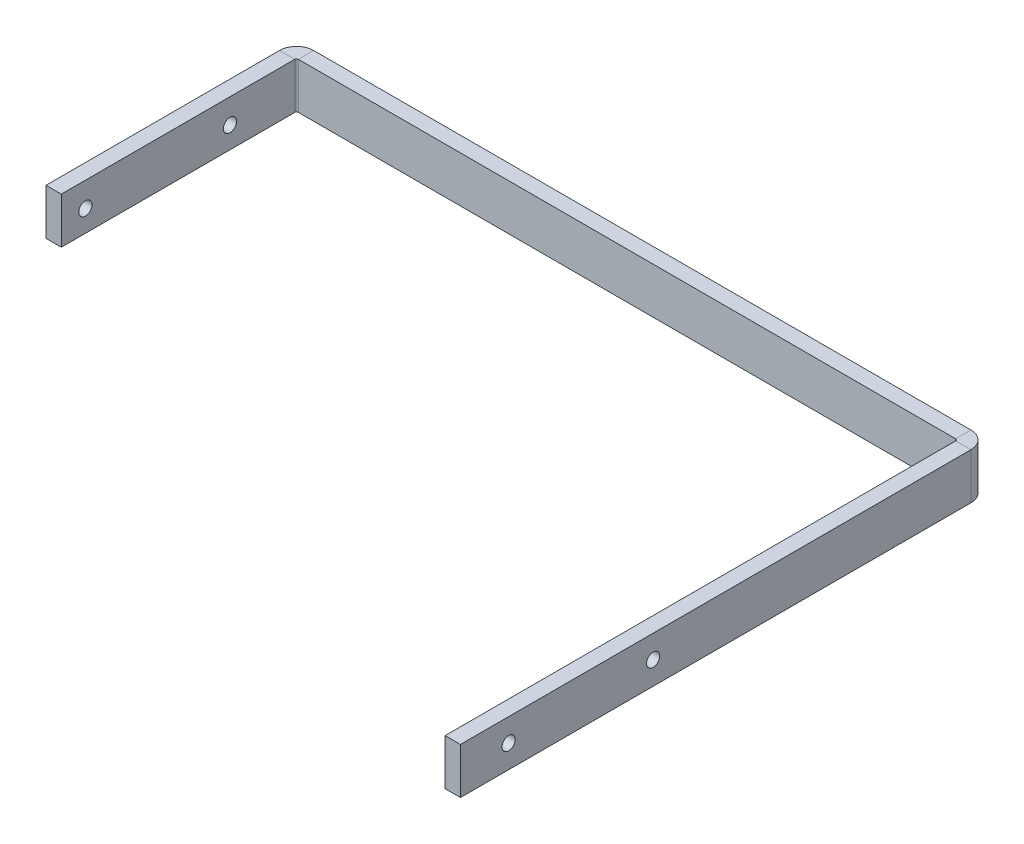
ISO-10303-21;
HEADER;
FILE_DESCRIPTION(('STEP AP214'),'2;1');
FILE_NAME('part.step','',(''),(''),'','','');
FILE_SCHEMA(('AUTOMOTIVE_DESIGN { 1 0 10303 214 1 1 1 1 }'));
ENDSEC;
DATA;
#1=APPLICATION_CONTEXT('core data for automotive mechanical design processes');
#2=APPLICATION_PROTOCOL_DEFINITION('international standard','automotive_design',2000,#1);
#3=PRODUCT_CONTEXT('',#1,'mechanical');
#4=PRODUCT('Part','Part','',(#3));
#5=PRODUCT_RELATED_PRODUCT_CATEGORY('part','',(#4));
#6=PRODUCT_DEFINITION_FORMATION('','',#4);
#7=PRODUCT_DEFINITION_CONTEXT('part definition',#1,'design');
#8=PRODUCT_DEFINITION('design','',#6,#7);
#9=PRODUCT_DEFINITION_SHAPE('','',#8);
#10=(LENGTH_UNIT() NAMED_UNIT(*) SI_UNIT(.MILLI.,.METRE.));
#11=(NAMED_UNIT(*) PLANE_ANGLE_UNIT() SI_UNIT($,.RADIAN.));
#12=(NAMED_UNIT(*) SI_UNIT($,.STERADIAN.) SOLID_ANGLE_UNIT());
#13=UNCERTAINTY_MEASURE_WITH_UNIT(LENGTH_MEASURE(1.E-05),#10,'distance_accuracy_value','');
#14=(GEOMETRIC_REPRESENTATION_CONTEXT(3) GLOBAL_UNCERTAINTY_ASSIGNED_CONTEXT((#13)) GLOBAL_UNIT_ASSIGNED_CONTEXT((#10,
#11,#12)) REPRESENTATION_CONTEXT('',''));
#15=CARTESIAN_POINT('',(0.,0.,0.));
#16=DIRECTION('',(0.,0.,1.));
#17=DIRECTION('',(1.,0.,0.));
#18=AXIS2_PLACEMENT_3D('',#15,#16,#17);
#19=CARTESIAN_POINT('',(355.844279829867,0.,-6.35));
#20=DIRECTION('',(0.,-1.,0.));
#21=DIRECTION('',(1.,0.,0.));
#22=AXIS2_PLACEMENT_3D('',#19,#20,#21);
#23=PLANE('',#22);
#24=DIRECTION('',(1.,0.,0.));
#25=VECTOR('',#24,1.);
#26=CARTESIAN_POINT('',(355.844279829867,0.,-6.35));
#27=LINE('',#26,#25);
#28=CARTESIAN_POINT('',(-135.083556714187,0.,-6.35));
#29=VERTEX_POINT('',#28);
#30=CARTESIAN_POINT('',(137.772116373922,0.,-6.35));
#31=VERTEX_POINT('',#30);
#32=EDGE_CURVE('E230',#29,#31,#27,.T.);
#33=ORIENTED_EDGE('',*,*,#32,.T.);
#34=DIRECTION('',(0.,0.,1.));
#35=VECTOR('',#34,1.);
#36=CARTESIAN_POINT('',(137.772116373922,0.,-6.35));
#37=LINE('',#36,#35);
#38=CARTESIAN_POINT('',(137.772116373922,0.,0.));
#39=VERTEX_POINT('',#38);
#40=EDGE_CURVE('E12',#31,#39,#37,.T.);
#41=ORIENTED_EDGE('',*,*,#40,.T.);
#42=DIRECTION('',(1.,0.,0.));
#43=VECTOR('',#42,1.);
#44=CARTESIAN_POINT('',(355.844279829867,0.,0.));
#45=LINE('',#44,#43);
#46=CARTESIAN_POINT('',(-135.083556714187,0.,0.));
#47=VERTEX_POINT('',#46);
#48=EDGE_CURVE('E247',#47,#39,#45,.T.);
#49=ORIENTED_EDGE('',*,*,#48,.F.);
#50=DIRECTION('',(0.,0.,1.));
#51=VECTOR('',#50,1.);
#52=CARTESIAN_POINT('',(-135.083556714187,0.,-6.35));
#53=LINE('',#52,#51);
#54=EDGE_CURVE('E229',#29,#47,#53,.T.);
#55=ORIENTED_EDGE('',*,*,#54,.F.);
#56=EDGE_LOOP('',(#33,#41,#49,#55));
#57=FACE_BOUND('',#56,.T.);
#58=ADVANCED_FACE('F48',(#57),#23,.T.);
#59=CARTESIAN_POINT('',(355.844279829867,19.0954773869347,-6.35));
#60=DIRECTION('',(0.,1.,0.));
#61=DIRECTION('',(-1.,0.,0.));
#62=AXIS2_PLACEMENT_3D('',#59,#60,#61);
#63=PLANE('',#62);
#64=DIRECTION('',(-1.,0.,0.));
#65=VECTOR('',#64,1.);
#66=CARTESIAN_POINT('',(355.844279829867,19.0954773869347,0.));
#67=LINE('',#66,#65);
#68=CARTESIAN_POINT('',(137.772116373922,19.0954773869347,0.));
#69=VERTEX_POINT('',#68);
#70=CARTESIAN_POINT('',(-135.083556714187,19.0954773869346,0.));
#71=VERTEX_POINT('',#70);
#72=EDGE_CURVE('E72',#69,#71,#67,.T.);
#73=ORIENTED_EDGE('',*,*,#72,.F.);
#74=DIRECTION('',(0.,0.,-1.));
#75=VECTOR('',#74,1.);
#76=CARTESIAN_POINT('',(137.772116373922,19.0954773869347,-6.35));
#77=LINE('',#76,#75);
#78=CARTESIAN_POINT('',(137.772116373922,19.0954773869347,-6.35));
#79=VERTEX_POINT('',#78);
#80=EDGE_CURVE('E241',#69,#79,#77,.T.);
#81=ORIENTED_EDGE('',*,*,#80,.T.);
#82=DIRECTION('',(-1.,0.,0.));
#83=VECTOR('',#82,1.);
#84=CARTESIAN_POINT('',(355.844279829867,19.0954773869347,-6.35));
#85=LINE('',#84,#83);
#86=CARTESIAN_POINT('',(-135.083556714187,19.0954773869347,-6.35));
#87=VERTEX_POINT('',#86);
#88=EDGE_CURVE('E51',#79,#87,#85,.T.);
#89=ORIENTED_EDGE('',*,*,#88,.T.);
#90=DIRECTION('',(0.,0.,-1.));
#91=VECTOR('',#90,1.);
#92=CARTESIAN_POINT('',(-135.083556714187,19.0954773869346,-6.35));
#93=LINE('',#92,#91);
#94=EDGE_CURVE('E235',#71,#87,#93,.T.);
#95=ORIENTED_EDGE('',*,*,#94,.F.);
#96=EDGE_LOOP('',(#73,#81,#89,#95));
#97=FACE_BOUND('',#96,.T.);
#98=ADVANCED_FACE('F252',(#97),#63,.T.);
#99=CARTESIAN_POINT('',(0.,0.,-6.35));
#100=DIRECTION('',(0.,0.,-1.));
#101=DIRECTION('',(-1.,0.,0.));
#102=AXIS2_PLACEMENT_3D('',#99,#100,#101);
#103=PLANE('',#102);
#104=ORIENTED_EDGE('',*,*,#88,.F.);
#105=DIRECTION('',(0.,-1.,0.));
#106=VECTOR('',#105,1.);
#107=CARTESIAN_POINT('',(137.772116373922,-2.00253930093311E-13,-6.35));
#108=LINE('',#107,#106);
#109=EDGE_CURVE('E238',#79,#31,#108,.T.);
#110=ORIENTED_EDGE('',*,*,#109,.T.);
#111=ORIENTED_EDGE('',*,*,#32,.F.);
#112=DIRECTION('',(0.,-1.,0.));
#113=VECTOR('',#112,1.);
#114=CARTESIAN_POINT('',(-135.083556714187,-1.96346066497089E-13,-6.35));
#115=LINE('',#114,#113);
#116=EDGE_CURVE('E226',#87,#29,#115,.T.);
#117=ORIENTED_EDGE('',*,*,#116,.F.);
#118=EDGE_LOOP('',(#104,#110,#111,#117));
#119=FACE_BOUND('',#118,.T.);
#120=ADVANCED_FACE('F303',(#119),#103,.T.);
#121=CARTESIAN_POINT('',(0.,0.,0.));
#122=DIRECTION('',(0.,0.,-1.));
#123=DIRECTION('',(-1.,0.,0.));
#124=AXIS2_PLACEMENT_3D('',#121,#122,#123);
#125=PLANE('',#124);
#126=DIRECTION('',(0.,-1.,0.));
#127=VECTOR('',#126,1.);
#128=CARTESIAN_POINT('',(137.772116373922,-2.00253930093311E-13,0.));
#129=LINE('',#128,#127);
#130=EDGE_CURVE('E56',#69,#39,#129,.T.);
#131=ORIENTED_EDGE('',*,*,#130,.F.);
#132=ORIENTED_EDGE('',*,*,#72,.T.);
#133=DIRECTION('',(0.,-1.,0.));
#134=VECTOR('',#133,1.);
#135=CARTESIAN_POINT('',(-135.083556714187,-1.96346066497089E-13,0.));
#136=LINE('',#135,#134);
#137=EDGE_CURVE('E233',#71,#47,#136,.T.);
#138=ORIENTED_EDGE('',*,*,#137,.T.);
#139=ORIENTED_EDGE('',*,*,#48,.T.);
#140=EDGE_LOOP('',(#131,#132,#138,#139));
#141=FACE_BOUND('',#140,.T.);
#142=ADVANCED_FACE('F526',(#141),#125,.F.);
#143=CARTESIAN_POINT('',(-135.083556714187,19.0954773869347,0.7366));
#144=DIRECTION('',(0.,1.,0.));
#145=DIRECTION('',(0.,0.,1.));
#146=AXIS2_PLACEMENT_3D('',#143,#144,#145);
#147=PLANE('',#146);
#148=DIRECTION('',(-1.,0.,0.));
#149=VECTOR('',#148,1.);
#150=CARTESIAN_POINT('',(-142.170156714187,19.0954773869346,0.736600000000032));
#151=LINE('',#150,#149);
#152=CARTESIAN_POINT('',(-135.820156714187,19.0954773869347,0.736600000000004));
#153=VERTEX_POINT('',#152);
#154=CARTESIAN_POINT('',(-142.170156714187,19.0954773869346,0.736600000000024));
#155=VERTEX_POINT('',#154);
#156=EDGE_CURVE('E191',#153,#155,#151,.T.);
#157=ORIENTED_EDGE('',*,*,#156,.F.);
#158=CARTESIAN_POINT('',(-135.083556714187,19.0954773869347,0.7366));
#159=DIRECTION('',(0.,1.,0.));
#160=DIRECTION('',(-1.,0.,0.));
#161=AXIS2_PLACEMENT_3D('',#158,#159,#160);
#162=CIRCLE('',#161,0.7366);
#163=EDGE_CURVE('E188',#153,#71,#162,.F.);
#164=ORIENTED_EDGE('',*,*,#163,.T.);
#165=ORIENTED_EDGE('',*,*,#94,.T.);
#166=CARTESIAN_POINT('',(-135.083556714187,19.0954773869347,0.7366));
#167=DIRECTION('',(0.,-1.,0.));
#168=DIRECTION('',(0.,0.,1.));
#169=AXIS2_PLACEMENT_3D('',#166,#167,#168);
#170=CIRCLE('',#169,7.0866);
#171=EDGE_CURVE('E215',#155,#87,#170,.T.);
#172=ORIENTED_EDGE('',*,*,#171,.F.);
#173=EDGE_LOOP('',(#157,#164,#165,#172));
#174=FACE_BOUND('',#173,.T.);
#175=ADVANCED_FACE('F258',(#174),#147,.T.);
#176=CARTESIAN_POINT('',(-135.083556714187,0.,0.7366));
#177=DIRECTION('',(0.,-1.,0.));
#178=DIRECTION('',(0.,0.,-1.));
#179=AXIS2_PLACEMENT_3D('',#176,#177,#178);
#180=PLANE('',#179);
#181=CARTESIAN_POINT('',(-135.083556714187,0.,0.7366));
#182=DIRECTION('',(0.,1.,0.));
#183=DIRECTION('',(-1.,0.,0.));
#184=AXIS2_PLACEMENT_3D('',#181,#182,#183);
#185=CIRCLE('',#184,0.7366);
#186=CARTESIAN_POINT('',(-135.820156714187,0.,0.736600000000032));
#187=VERTEX_POINT('',#186);
#188=EDGE_CURVE('E219',#47,#187,#185,.T.);
#189=ORIENTED_EDGE('',*,*,#188,.T.);
#190=DIRECTION('',(1.,0.,0.));
#191=VECTOR('',#190,1.);
#192=CARTESIAN_POINT('',(-142.170156714187,0.,0.736600000000059));
#193=LINE('',#192,#191);
#194=CARTESIAN_POINT('',(-142.170156714187,0.,0.736600000000059));
#195=VERTEX_POINT('',#194);
#196=EDGE_CURVE('E200',#195,#187,#193,.T.);
#197=ORIENTED_EDGE('',*,*,#196,.F.);
#198=CARTESIAN_POINT('',(-135.083556714187,0.,0.7366));
#199=DIRECTION('',(0.,1.,0.));
#200=DIRECTION('',(0.,0.,-1.));
#201=AXIS2_PLACEMENT_3D('',#198,#199,#200);
#202=CIRCLE('',#201,7.0866);
#203=EDGE_CURVE('E218',#29,#195,#202,.T.);
#204=ORIENTED_EDGE('',*,*,#203,.F.);
#205=ORIENTED_EDGE('',*,*,#54,.T.);
#206=EDGE_LOOP('',(#189,#197,#204,#205));
#207=FACE_BOUND('',#206,.T.);
#208=ADVANCED_FACE('F274',(#207),#180,.T.);
#209=CARTESIAN_POINT('',(-135.083556714187,-11.4929958430245,0.7366));
#210=DIRECTION('',(0.,1.,0.));
#211=DIRECTION('',(-1.,0.,0.));
#212=AXIS2_PLACEMENT_3D('',#209,#210,#211);
#213=CYLINDRICAL_SURFACE('',#212,7.0866);
#214=ORIENTED_EDGE('',*,*,#116,.T.);
#215=ORIENTED_EDGE('',*,*,#203,.T.);
#216=DIRECTION('',(0.,-1.,0.));
#217=VECTOR('',#216,1.);
#218=CARTESIAN_POINT('',(-142.170156714187,-2.03518853816425E-13,0.736600000000032));
#219=LINE('',#218,#217);
#220=EDGE_CURVE('E206',#155,#195,#219,.T.);
#221=ORIENTED_EDGE('',*,*,#220,.F.);
#222=ORIENTED_EDGE('',*,*,#171,.T.);
#223=EDGE_LOOP('',(#214,#215,#221,#222));
#224=FACE_BOUND('',#223,.T.);
#225=ADVANCED_FACE('F262',(#224),#213,.T.);
#226=CARTESIAN_POINT('',(-135.083556714187,-11.4929958430245,0.7366));
#227=DIRECTION('',(0.,1.,0.));
#228=DIRECTION('',(-1.,0.,0.));
#229=AXIS2_PLACEMENT_3D('',#226,#227,#228);
#230=CYLINDRICAL_SURFACE('',#229,0.7366);
#231=ORIENTED_EDGE('',*,*,#137,.F.);
#232=ORIENTED_EDGE('',*,*,#163,.F.);
#233=DIRECTION('',(0.,-1.,0.));
#234=VECTOR('',#233,1.);
#235=CARTESIAN_POINT('',(-135.820156714187,-1.94289029309402E-13,0.736600000000004));
#236=LINE('',#235,#234);
#237=EDGE_CURVE('E181',#153,#187,#236,.T.);
#238=ORIENTED_EDGE('',*,*,#237,.T.);
#239=ORIENTED_EDGE('',*,*,#188,.F.);
#240=EDGE_LOOP('',(#231,#232,#238,#239));
#241=FACE_BOUND('',#240,.T.);
#242=ADVANCED_FACE('F278',(#241),#230,.F.);
#243=CARTESIAN_POINT('',(-142.170156714187,19.0954773869348,97.6644365440545));
#244=DIRECTION('',(0.,0.,1.));
#245=DIRECTION('',(1.,0.,0.));
#246=AXIS2_PLACEMENT_3D('',#243,#244,#245);
#247=PLANE('',#246);
#248=DIRECTION('',(0.,-1.,0.));
#249=VECTOR('',#248,1.);
#250=CARTESIAN_POINT('',(-135.820156714187,19.0954773869348,97.6644365440545));
#251=LINE('',#250,#249);
#252=CARTESIAN_POINT('',(-135.820156714187,19.0954773869348,97.6644365440545));
#253=VERTEX_POINT('',#252);
#254=CARTESIAN_POINT('',(-135.820156714187,1.51874041952668E-13,97.6644365440545));
#255=VERTEX_POINT('',#254);
#256=EDGE_CURVE('E195',#253,#255,#251,.T.);
#257=ORIENTED_EDGE('',*,*,#256,.F.);
#258=DIRECTION('',(1.,0.,0.));
#259=VECTOR('',#258,1.);
#260=CARTESIAN_POINT('',(-142.170156714187,19.0954773869348,97.6644365440545));
#261=LINE('',#260,#259);
#262=CARTESIAN_POINT('',(-142.170156714187,19.0954773869348,97.6644365440545));
#263=VERTEX_POINT('',#262);
#264=EDGE_CURVE('E185',#263,#253,#261,.T.);
#265=ORIENTED_EDGE('',*,*,#264,.F.);
#266=DIRECTION('',(0.,-1.,0.));
#267=VECTOR('',#266,1.);
#268=CARTESIAN_POINT('',(-142.170156714187,19.0954773869348,97.6644365440545));
#269=LINE('',#268,#267);
#270=CARTESIAN_POINT('',(-142.170156714187,1.42644217445644E-13,97.6644365440546));
#271=VERTEX_POINT('',#270);
#272=EDGE_CURVE('E210',#263,#271,#269,.T.);
#273=ORIENTED_EDGE('',*,*,#272,.T.);
#274=DIRECTION('',(1.,0.,0.));
#275=VECTOR('',#274,1.);
#276=CARTESIAN_POINT('',(-142.170156714187,1.42644217445644E-13,97.6644365440546));
#277=LINE('',#276,#275);
#278=EDGE_CURVE('E208',#271,#255,#277,.T.);
#279=ORIENTED_EDGE('',*,*,#278,.T.);
#280=EDGE_LOOP('',(#257,#265,#273,#279));
#281=FACE_BOUND('',#280,.T.);
#282=ADVANCED_FACE('F287',(#281),#247,.T.);
#283=CARTESIAN_POINT('',(-142.170156714188,-2.03518853816426E-13,-140.491283626078));
#284=DIRECTION('',(-1.,0.,0.));
#285=DIRECTION('',(0.,0.,1.));
#286=AXIS2_PLACEMENT_3D('',#283,#284,#285);
#287=PLANE('',#286);
#288=CARTESIAN_POINT('',(-142.170156714188,8.93598728636371,87.6644365440546));
#289=DIRECTION('',(1.,0.,0.));
#290=DIRECTION('',(0.,0.,-1.));
#291=AXIS2_PLACEMENT_3D('',#288,#289,#290);
#292=CIRCLE('',#291,2.75);
#293=CARTESIAN_POINT('',(-142.170156714188,8.93598728636371,84.9144365440546));
#294=VERTEX_POINT('',#293);
#295=EDGE_CURVE('E346',#294,#294,#292,.T.);
#296=ORIENTED_EDGE('',*,*,#295,.T.);
#297=EDGE_LOOP('',(#296));
#298=FACE_BOUND('',#297,.T.);
#299=CARTESIAN_POINT('',(-142.170156714188,8.93598728636371,27.6644365440546));
#300=DIRECTION('',(1.,0.,0.));
#301=DIRECTION('',(0.,0.,-1.));
#302=AXIS2_PLACEMENT_3D('',#299,#300,#301);
#303=CIRCLE('',#302,2.75);
#304=CARTESIAN_POINT('',(-142.170156714188,8.93598728636371,24.9144365440546));
#305=VERTEX_POINT('',#304);
#306=EDGE_CURVE('E340',#305,#305,#303,.T.);
#307=ORIENTED_EDGE('',*,*,#306,.T.);
#308=EDGE_LOOP('',(#307));
#309=FACE_BOUND('',#308,.T.);
#310=DIRECTION('',(0.,0.,1.));
#311=VECTOR('',#310,1.);
#312=CARTESIAN_POINT('',(-142.170156714189,19.095477386934,-496.335563455945));
#313=LINE('',#312,#311);
#314=EDGE_CURVE('E189',#155,#263,#313,.T.);
#315=ORIENTED_EDGE('',*,*,#314,.F.);
#316=ORIENTED_EDGE('',*,*,#220,.T.);
#317=DIRECTION('',(0.,0.,-1.));
#318=VECTOR('',#317,1.);
#319=CARTESIAN_POINT('',(-142.170156714189,-6.48000070901069E-13,-496.335563455945));
#320=LINE('',#319,#318);
#321=EDGE_CURVE('E203',#271,#195,#320,.T.);
#322=ORIENTED_EDGE('',*,*,#321,.F.);
#323=ORIENTED_EDGE('',*,*,#272,.F.);
#324=EDGE_LOOP('',(#315,#316,#322,#323));
#325=FACE_BOUND('',#324,.T.);
#326=ADVANCED_FACE('F267',(#298,#309,#325),#287,.T.);
#327=CARTESIAN_POINT('',(-142.170156714189,-6.48000070901069E-13,-496.335563455945));
#328=DIRECTION('',(0.,-1.,0.));
#329=DIRECTION('',(0.,0.,-1.));
#330=AXIS2_PLACEMENT_3D('',#327,#328,#329);
#331=PLANE('',#330);
#332=ORIENTED_EDGE('',*,*,#321,.T.);
#333=ORIENTED_EDGE('',*,*,#196,.T.);
#334=DIRECTION('',(0.,0.,-1.));
#335=VECTOR('',#334,1.);
#336=CARTESIAN_POINT('',(-135.820156714189,-6.38770246394045E-13,-496.335563455945));
#337=LINE('',#336,#335);
#338=EDGE_CURVE('E193',#255,#187,#337,.T.);
#339=ORIENTED_EDGE('',*,*,#338,.F.);
#340=ORIENTED_EDGE('',*,*,#278,.F.);
#341=EDGE_LOOP('',(#332,#333,#339,#340));
#342=FACE_BOUND('',#341,.T.);
#343=ADVANCED_FACE('F271',(#342),#331,.T.);
#344=CARTESIAN_POINT('',(-135.820156714188,-1.94289029309402E-13,-140.491283626078));
#345=DIRECTION('',(-1.,0.,0.));
#346=DIRECTION('',(0.,0.,1.));
#347=AXIS2_PLACEMENT_3D('',#344,#345,#346);
#348=PLANE('',#347);
#349=CARTESIAN_POINT('',(-135.820156714187,8.93598728636371,87.6644365440546));
#350=DIRECTION('',(1.,0.,0.));
#351=DIRECTION('',(0.,0.,-1.));
#352=AXIS2_PLACEMENT_3D('',#349,#350,#351);
#353=CIRCLE('',#352,2.74999999999999);
#354=CARTESIAN_POINT('',(-135.820156714187,8.93598728636371,84.9144365440546));
#355=VERTEX_POINT('',#354);
#356=EDGE_CURVE('E349',#355,#355,#353,.T.);
#357=ORIENTED_EDGE('',*,*,#356,.F.);
#358=EDGE_LOOP('',(#357));
#359=FACE_BOUND('',#358,.T.);
#360=CARTESIAN_POINT('',(-135.820156714187,8.93598728636371,27.6644365440546));
#361=DIRECTION('',(1.,0.,0.));
#362=DIRECTION('',(0.,0.,-1.));
#363=AXIS2_PLACEMENT_3D('',#360,#361,#362);
#364=CIRCLE('',#363,2.74999999999999);
#365=CARTESIAN_POINT('',(-135.820156714187,8.93598728636371,24.9144365440546));
#366=VERTEX_POINT('',#365);
#367=EDGE_CURVE('E343',#366,#366,#364,.T.);
#368=ORIENTED_EDGE('',*,*,#367,.F.);
#369=EDGE_LOOP('',(#368));
#370=FACE_BOUND('',#369,.T.);
#371=ORIENTED_EDGE('',*,*,#237,.F.);
#372=DIRECTION('',(0.,0.,1.));
#373=VECTOR('',#372,1.);
#374=CARTESIAN_POINT('',(-135.820156714189,19.095477386934,-496.335563455945));
#375=LINE('',#374,#373);
#376=EDGE_CURVE('E198',#153,#253,#375,.T.);
#377=ORIENTED_EDGE('',*,*,#376,.T.);
#378=ORIENTED_EDGE('',*,*,#256,.T.);
#379=ORIENTED_EDGE('',*,*,#338,.T.);
#380=EDGE_LOOP('',(#371,#377,#378,#379));
#381=FACE_BOUND('',#380,.T.);
#382=ADVANCED_FACE('F281',(#359,#370,#381),#348,.F.);
#383=CARTESIAN_POINT('',(-142.170156714189,19.095477386934,-496.335563455945));
#384=DIRECTION('',(0.,1.,0.));
#385=DIRECTION('',(0.,0.,1.));
#386=AXIS2_PLACEMENT_3D('',#383,#384,#385);
#387=PLANE('',#386);
#388=ORIENTED_EDGE('',*,*,#376,.F.);
#389=ORIENTED_EDGE('',*,*,#156,.T.);
#390=ORIENTED_EDGE('',*,*,#314,.T.);
#391=ORIENTED_EDGE('',*,*,#264,.T.);
#392=EDGE_LOOP('',(#388,#389,#390,#391));
#393=FACE_BOUND('',#392,.T.);
#394=ADVANCED_FACE('F283',(#393),#387,.T.);
#395=CARTESIAN_POINT('',(137.772116373922,19.0954773869347,0.7366));
#396=DIRECTION('',(0.,1.,0.));
#397=DIRECTION('',(-1.,0.,0.));
#398=AXIS2_PLACEMENT_3D('',#395,#396,#397);
#399=PLANE('',#398);
#400=ORIENTED_EDGE('',*,*,#80,.F.);
#401=CARTESIAN_POINT('',(137.772116373922,19.0954773869347,0.7366));
#402=DIRECTION('',(0.,-1.,0.));
#403=DIRECTION('',(1.,0.,0.));
#404=AXIS2_PLACEMENT_3D('',#401,#402,#403);
#405=CIRCLE('',#404,0.7366);
#406=CARTESIAN_POINT('',(138.508716373922,19.0954773869347,0.736600000000004));
#407=VERTEX_POINT('',#406);
#408=EDGE_CURVE('E157',#69,#407,#405,.T.);
#409=ORIENTED_EDGE('',*,*,#408,.T.);
#410=DIRECTION('',(1.,0.,0.));
#411=VECTOR('',#410,1.);
#412=CARTESIAN_POINT('',(144.858716373922,19.0954773869347,0.736600000000032));
#413=LINE('',#412,#411);
#414=CARTESIAN_POINT('',(144.858716373922,19.0954773869347,0.736600000000004));
#415=VERTEX_POINT('',#414);
#416=EDGE_CURVE('E164',#407,#415,#413,.T.);
#417=ORIENTED_EDGE('',*,*,#416,.T.);
#418=CARTESIAN_POINT('',(137.772116373922,19.0954773869347,0.7366));
#419=DIRECTION('',(0.,-1.,0.));
#420=DIRECTION('',(-1.,0.,0.));
#421=AXIS2_PLACEMENT_3D('',#418,#419,#420);
#422=CIRCLE('',#421,7.08659999999999);
#423=EDGE_CURVE('E175',#79,#415,#422,.T.);
#424=ORIENTED_EDGE('',*,*,#423,.F.);
#425=EDGE_LOOP('',(#400,#409,#417,#424));
#426=FACE_BOUND('',#425,.T.);
#427=ADVANCED_FACE('F310',(#426),#399,.T.);
#428=CARTESIAN_POINT('',(137.772116373922,0.,0.7366));
#429=DIRECTION('',(0.,-1.,0.));
#430=DIRECTION('',(1.,0.,0.));
#431=AXIS2_PLACEMENT_3D('',#428,#429,#430);
#432=PLANE('',#431);
#433=CARTESIAN_POINT('',(137.772116373922,0.,0.7366));
#434=DIRECTION('',(0.,-1.,0.));
#435=DIRECTION('',(1.,0.,0.));
#436=AXIS2_PLACEMENT_3D('',#433,#434,#435);
#437=CIRCLE('',#436,0.7366);
#438=CARTESIAN_POINT('',(138.508716373922,0.,0.736600000000004));
#439=VERTEX_POINT('',#438);
#440=EDGE_CURVE('E64',#439,#39,#437,.F.);
#441=ORIENTED_EDGE('',*,*,#440,.T.);
#442=ORIENTED_EDGE('',*,*,#40,.F.);
#443=CARTESIAN_POINT('',(137.772116373922,0.,0.7366));
#444=DIRECTION('',(0.,1.,0.));
#445=DIRECTION('',(1.,0.,0.));
#446=AXIS2_PLACEMENT_3D('',#443,#444,#445);
#447=CIRCLE('',#446,7.0866);
#448=CARTESIAN_POINT('',(144.858716373922,0.,0.736600000000024));
#449=VERTEX_POINT('',#448);
#450=EDGE_CURVE('E178',#449,#31,#447,.T.);
#451=ORIENTED_EDGE('',*,*,#450,.F.);
#452=DIRECTION('',(-1.,0.,0.));
#453=VECTOR('',#452,1.);
#454=CARTESIAN_POINT('',(144.858716373922,0.,0.736600000000032));
#455=LINE('',#454,#453);
#456=EDGE_CURVE('E146',#449,#439,#455,.T.);
#457=ORIENTED_EDGE('',*,*,#456,.T.);
#458=EDGE_LOOP('',(#441,#442,#451,#457));
#459=FACE_BOUND('',#458,.T.);
#460=ADVANCED_FACE('F394',(#459),#432,.T.);
#461=CARTESIAN_POINT('',(137.772116373922,30.5884732299592,0.7366));
#462=DIRECTION('',(0.,-1.,0.));
#463=DIRECTION('',(1.,0.,0.));
#464=AXIS2_PLACEMENT_3D('',#461,#462,#463);
#465=CYLINDRICAL_SURFACE('',#464,7.0866);
#466=DIRECTION('',(0.,-1.,0.));
#467=VECTOR('',#466,1.);
#468=CARTESIAN_POINT('',(144.858716373922,-2.10554414243149E-13,0.736600000000032));
#469=LINE('',#468,#467);
#470=EDGE_CURVE('E172',#415,#449,#469,.T.);
#471=ORIENTED_EDGE('',*,*,#470,.T.);
#472=ORIENTED_EDGE('',*,*,#450,.T.);
#473=ORIENTED_EDGE('',*,*,#109,.F.);
#474=ORIENTED_EDGE('',*,*,#423,.T.);
#475=EDGE_LOOP('',(#471,#472,#473,#474));
#476=FACE_BOUND('',#475,.T.);
#477=ADVANCED_FACE('F307',(#476),#465,.T.);
#478=CARTESIAN_POINT('',(137.772116373922,30.5884732299592,0.7366));
#479=DIRECTION('',(0.,-1.,0.));
#480=DIRECTION('',(1.,0.,0.));
#481=AXIS2_PLACEMENT_3D('',#478,#479,#480);
#482=CYLINDRICAL_SURFACE('',#481,0.7366);
#483=DIRECTION('',(0.,-1.,0.));
#484=VECTOR('',#483,1.);
#485=CARTESIAN_POINT('',(138.508716373922,-2.01324589736126E-13,0.736600000000004));
#486=LINE('',#485,#484);
#487=EDGE_CURVE('E320',#407,#439,#486,.T.);
#488=ORIENTED_EDGE('',*,*,#487,.F.);
#489=ORIENTED_EDGE('',*,*,#408,.F.);
#490=ORIENTED_EDGE('',*,*,#130,.T.);
#491=ORIENTED_EDGE('',*,*,#440,.F.);
#492=EDGE_LOOP('',(#488,#489,#490,#491));
#493=FACE_BOUND('',#492,.T.);
#494=ADVANCED_FACE('F321',(#493),#482,.F.);
#495=CARTESIAN_POINT('',(144.858716373921,19.095477386935,212.664436544054));
#496=DIRECTION('',(0.,0.,1.));
#497=DIRECTION('',(1.,0.,0.));
#498=AXIS2_PLACEMENT_3D('',#495,#496,#497);
#499=PLANE('',#498);
#500=DIRECTION('',(0.,1.,0.));
#501=VECTOR('',#500,1.);
#502=CARTESIAN_POINT('',(138.508716373921,19.095477386935,212.664436544054));
#503=LINE('',#502,#501);
#504=CARTESIAN_POINT('',(138.508716373921,3.88644667087222E-13,212.664436544054));
#505=VERTEX_POINT('',#504);
#506=CARTESIAN_POINT('',(138.508716373921,19.095477386935,212.664436544054));
#507=VERTEX_POINT('',#506);
#508=EDGE_CURVE('E150',#505,#507,#503,.T.);
#509=ORIENTED_EDGE('',*,*,#508,.F.);
#510=DIRECTION('',(-1.,0.,0.));
#511=VECTOR('',#510,1.);
#512=CARTESIAN_POINT('',(144.858716373921,3.79414842580198E-13,212.664436544054));
#513=LINE('',#512,#511);
#514=CARTESIAN_POINT('',(144.858716373921,3.79414842580198E-13,212.664436544054));
#515=VERTEX_POINT('',#514);
#516=EDGE_CURVE('E144',#515,#505,#513,.T.);
#517=ORIENTED_EDGE('',*,*,#516,.F.);
#518=DIRECTION('',(0.,1.,0.));
#519=VECTOR('',#518,1.);
#520=CARTESIAN_POINT('',(144.858716373921,19.095477386935,212.664436544054));
#521=LINE('',#520,#519);
#522=CARTESIAN_POINT('',(144.858716373921,19.095477386935,212.664436544054));
#523=VERTEX_POINT('',#522);
#524=EDGE_CURVE('E155',#515,#523,#521,.T.);
#525=ORIENTED_EDGE('',*,*,#524,.T.);
#526=DIRECTION('',(-1.,0.,0.));
#527=VECTOR('',#526,1.);
#528=CARTESIAN_POINT('',(144.858716373921,19.095477386935,212.664436544054));
#529=LINE('',#528,#527);
#530=EDGE_CURVE('E163',#523,#507,#529,.T.);
#531=ORIENTED_EDGE('',*,*,#530,.T.);
#532=EDGE_LOOP('',(#509,#517,#525,#531));
#533=FACE_BOUND('',#532,.T.);
#534=ADVANCED_FACE('F154',(#533),#499,.T.);
#535=CARTESIAN_POINT('',(144.858716373922,-2.1055441424315E-13,-143.179843285813));
#536=DIRECTION('',(1.,0.,0.));
#537=DIRECTION('',(0.,0.,-1.));
#538=AXIS2_PLACEMENT_3D('',#535,#536,#537);
#539=PLANE('',#538);
#540=CARTESIAN_POINT('',(144.858716373921,9.54773869346706,192.664436544055));
#541=DIRECTION('',(1.,0.,0.));
#542=DIRECTION('',(0.,0.,-1.));
#543=AXIS2_PLACEMENT_3D('',#540,#541,#542);
#544=CIRCLE('',#543,2.74999999999997);
#545=CARTESIAN_POINT('',(144.858716373921,9.54773869346706,189.914436544055));
#546=VERTEX_POINT('',#545);
#547=EDGE_CURVE('E337',#546,#546,#544,.T.);
#548=ORIENTED_EDGE('',*,*,#547,.F.);
#549=EDGE_LOOP('',(#548));
#550=FACE_BOUND('',#549,.T.);
#551=CARTESIAN_POINT('',(144.858716373921,9.54773869346706,132.664436544055));
#552=DIRECTION('',(1.,0.,0.));
#553=DIRECTION('',(0.,0.,-1.));
#554=AXIS2_PLACEMENT_3D('',#551,#552,#553);
#555=CIRCLE('',#554,2.74999999999997);
#556=CARTESIAN_POINT('',(144.858716373921,9.54773869346706,129.914436544055));
#557=VERTEX_POINT('',#556);
#558=EDGE_CURVE('E331',#557,#557,#555,.T.);
#559=ORIENTED_EDGE('',*,*,#558,.F.);
#560=EDGE_LOOP('',(#559));
#561=FACE_BOUND('',#560,.T.);
#562=ORIENTED_EDGE('',*,*,#470,.F.);
#563=DIRECTION('',(0.,0.,-1.));
#564=VECTOR('',#563,1.);
#565=CARTESIAN_POINT('',(144.858716373921,19.095477386935,212.664436544054));
#566=LINE('',#565,#564);
#567=EDGE_CURVE('E162',#523,#415,#566,.T.);
#568=ORIENTED_EDGE('',*,*,#567,.F.);
#569=ORIENTED_EDGE('',*,*,#524,.F.);
#570=DIRECTION('',(0.,0.,1.));
#571=VECTOR('',#570,1.);
#572=CARTESIAN_POINT('',(144.858716373921,3.79414842580198E-13,212.664436544054));
#573=LINE('',#572,#571);
#574=EDGE_CURVE('E141',#449,#515,#573,.T.);
#575=ORIENTED_EDGE('',*,*,#574,.F.);
#576=EDGE_LOOP('',(#562,#568,#569,#575));
#577=FACE_BOUND('',#576,.T.);
#578=ADVANCED_FACE('F160',(#550,#561,#577),#539,.T.);
#579=CARTESIAN_POINT('',(144.858716373921,19.095477386935,212.664436544054));
#580=DIRECTION('',(0.,1.,0.));
#581=DIRECTION('',(0.,0.,-1.));
#582=AXIS2_PLACEMENT_3D('',#579,#580,#581);
#583=PLANE('',#582);
#584=ORIENTED_EDGE('',*,*,#416,.F.);
#585=DIRECTION('',(0.,0.,-1.));
#586=VECTOR('',#585,1.);
#587=CARTESIAN_POINT('',(138.508716373921,19.095477386935,212.664436544054));
#588=LINE('',#587,#586);
#589=EDGE_CURVE('E317',#507,#407,#588,.T.);
#590=ORIENTED_EDGE('',*,*,#589,.F.);
#591=ORIENTED_EDGE('',*,*,#530,.F.);
#592=ORIENTED_EDGE('',*,*,#567,.T.);
#593=EDGE_LOOP('',(#584,#590,#591,#592));
#594=FACE_BOUND('',#593,.T.);
#595=ADVANCED_FACE('F316',(#594),#583,.T.);
#596=CARTESIAN_POINT('',(138.508716373922,-2.01324589736127E-13,-143.179843285813));
#597=DIRECTION('',(1.,0.,0.));
#598=DIRECTION('',(0.,0.,-1.));
#599=AXIS2_PLACEMENT_3D('',#596,#597,#598);
#600=PLANE('',#599);
#601=CARTESIAN_POINT('',(138.508716373921,9.54773869346706,192.664436544054));
#602=DIRECTION('',(1.,0.,0.));
#603=DIRECTION('',(0.,0.,-1.));
#604=AXIS2_PLACEMENT_3D('',#601,#602,#603);
#605=CIRCLE('',#604,2.74999999999996);
#606=CARTESIAN_POINT('',(138.508716373921,9.54773869346706,189.914436544055));
#607=VERTEX_POINT('',#606);
#608=EDGE_CURVE('E334',#607,#607,#605,.T.);
#609=ORIENTED_EDGE('',*,*,#608,.T.);
#610=EDGE_LOOP('',(#609));
#611=FACE_BOUND('',#610,.T.);
#612=CARTESIAN_POINT('',(138.508716373921,9.54773869346706,132.664436544054));
#613=DIRECTION('',(1.,0.,0.));
#614=DIRECTION('',(0.,0.,-1.));
#615=AXIS2_PLACEMENT_3D('',#612,#613,#614);
#616=CIRCLE('',#615,2.74999999999996);
#617=CARTESIAN_POINT('',(138.508716373921,9.54773869346706,129.914436544055));
#618=VERTEX_POINT('',#617);
#619=EDGE_CURVE('E174',#618,#618,#616,.T.);
#620=ORIENTED_EDGE('',*,*,#619,.T.);
#621=EDGE_LOOP('',(#620));
#622=FACE_BOUND('',#621,.T.);
#623=ORIENTED_EDGE('',*,*,#589,.T.);
#624=ORIENTED_EDGE('',*,*,#487,.T.);
#625=DIRECTION('',(0.,0.,1.));
#626=VECTOR('',#625,1.);
#627=CARTESIAN_POINT('',(138.508716373921,3.88644667087222E-13,212.664436544054));
#628=LINE('',#627,#626);
#629=EDGE_CURVE('E323',#439,#505,#628,.T.);
#630=ORIENTED_EDGE('',*,*,#629,.T.);
#631=ORIENTED_EDGE('',*,*,#508,.T.);
#632=EDGE_LOOP('',(#623,#624,#630,#631));
#633=FACE_BOUND('',#632,.T.);
#634=ADVANCED_FACE('F386',(#611,#622,#633),#600,.F.);
#635=CARTESIAN_POINT('',(144.858716373921,3.79414842580198E-13,212.664436544054));
#636=DIRECTION('',(0.,-1.,0.));
#637=DIRECTION('',(0.,0.,1.));
#638=AXIS2_PLACEMENT_3D('',#635,#636,#637);
#639=PLANE('',#638);
#640=ORIENTED_EDGE('',*,*,#456,.F.);
#641=ORIENTED_EDGE('',*,*,#574,.T.);
#642=ORIENTED_EDGE('',*,*,#516,.T.);
#643=ORIENTED_EDGE('',*,*,#629,.F.);
#644=EDGE_LOOP('',(#640,#641,#642,#643));
#645=FACE_BOUND('',#644,.T.);
#646=ADVANCED_FACE('F143',(#645),#639,.T.);
#647=CARTESIAN_POINT('',(144.858716373921,9.54773869346706,132.664436544055));
#648=DIRECTION('',(1.,0.,0.));
#649=DIRECTION('',(0.,0.,-1.));
#650=AXIS2_PLACEMENT_3D('',#647,#648,#649);
#651=CYLINDRICAL_SURFACE('',#650,2.74999999999996);
#652=ORIENTED_EDGE('',*,*,#558,.T.);
#653=EDGE_LOOP('',(#652));
#654=FACE_BOUND('',#653,.T.);
#655=ORIENTED_EDGE('',*,*,#619,.F.);
#656=EDGE_LOOP('',(#655));
#657=FACE_BOUND('',#656,.T.);
#658=ADVANCED_FACE('F371',(#654,#657),#651,.F.);
#659=CARTESIAN_POINT('',(144.858716373921,9.54773869346706,192.664436544055));
#660=DIRECTION('',(1.,0.,0.));
#661=DIRECTION('',(0.,0.,-1.));
#662=AXIS2_PLACEMENT_3D('',#659,#660,#661);
#663=CYLINDRICAL_SURFACE('',#662,2.74999999999996);
#664=ORIENTED_EDGE('',*,*,#547,.T.);
#665=EDGE_LOOP('',(#664));
#666=FACE_BOUND('',#665,.T.);
#667=ORIENTED_EDGE('',*,*,#608,.F.);
#668=EDGE_LOOP('',(#667));
#669=FACE_BOUND('',#668,.T.);
#670=ADVANCED_FACE('F362',(#666,#669),#663,.F.);
#671=CARTESIAN_POINT('',(-135.820156714187,8.93598728636371,27.6644365440546));
#672=DIRECTION('',(1.,0.,0.));
#673=DIRECTION('',(0.,0.,-1.));
#674=AXIS2_PLACEMENT_3D('',#671,#672,#673);
#675=CYLINDRICAL_SURFACE('',#674,2.74999999999999);
#676=ORIENTED_EDGE('',*,*,#306,.F.);
#677=EDGE_LOOP('',(#676));
#678=FACE_BOUND('',#677,.T.);
#679=ORIENTED_EDGE('',*,*,#367,.T.);
#680=EDGE_LOOP('',(#679));
#681=FACE_BOUND('',#680,.T.);
#682=ADVANCED_FACE('F360',(#678,#681),#675,.F.);
#683=CARTESIAN_POINT('',(-135.820156714187,8.93598728636371,87.6644365440546));
#684=DIRECTION('',(1.,0.,0.));
#685=DIRECTION('',(0.,0.,-1.));
#686=AXIS2_PLACEMENT_3D('',#683,#684,#685);
#687=CYLINDRICAL_SURFACE('',#686,2.74999999999999);
#688=ORIENTED_EDGE('',*,*,#295,.F.);
#689=EDGE_LOOP('',(#688));
#690=FACE_BOUND('',#689,.T.);
#691=ORIENTED_EDGE('',*,*,#356,.T.);
#692=EDGE_LOOP('',(#691));
#693=FACE_BOUND('',#692,.T.);
#694=ADVANCED_FACE('F353',(#690,#693),#687,.F.);
#695=CLOSED_SHELL('',(#58,#98,#120,#142,#175,#208,#225,#242,#282,#326,#343,#382,#394,#427,#460,
#477,#494,#534,#578,#595,#634,#646,#658,#670,#682,#694));
#696=MANIFOLD_SOLID_BREP('B2',#695);
#697=ADVANCED_BREP_SHAPE_REPRESENTATION('',(#18,#696),#14);
#698=SHAPE_DEFINITION_REPRESENTATION(#9,#697);
ENDSEC;
END-ISO-10303-21;
